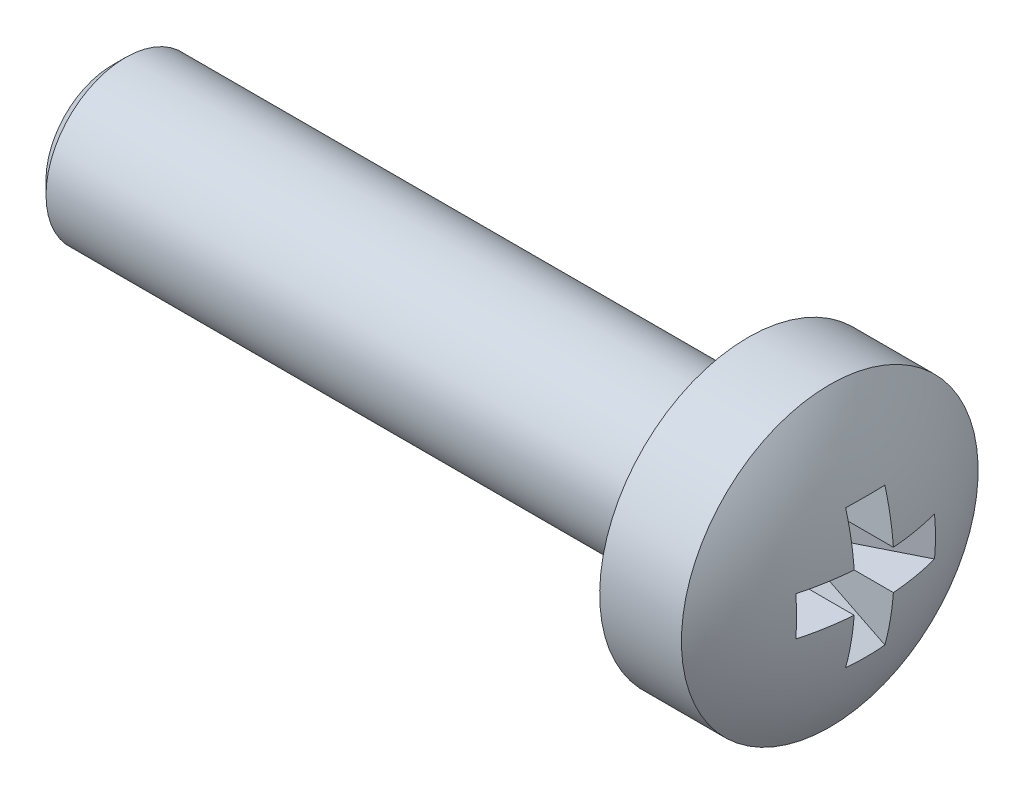
ISO-10303-21;
HEADER;
FILE_DESCRIPTION(('STEP AP214'),'2;1');
FILE_NAME('part.step','',(''),(''),'','','');
FILE_SCHEMA(('AUTOMOTIVE_DESIGN { 1 0 10303 214 1 1 1 1 }'));
ENDSEC;
DATA;
#1=APPLICATION_CONTEXT('core data for automotive mechanical design processes');
#2=APPLICATION_PROTOCOL_DEFINITION('international standard','automotive_design',2000,#1);
#3=PRODUCT_CONTEXT('',#1,'mechanical');
#4=PRODUCT('Part','Part','',(#3));
#5=PRODUCT_RELATED_PRODUCT_CATEGORY('part','',(#4));
#6=PRODUCT_DEFINITION_FORMATION('','',#4);
#7=PRODUCT_DEFINITION_CONTEXT('part definition',#1,'design');
#8=PRODUCT_DEFINITION('design','',#6,#7);
#9=PRODUCT_DEFINITION_SHAPE('','',#8);
#10=(LENGTH_UNIT() NAMED_UNIT(*) SI_UNIT(.MILLI.,.METRE.));
#11=(NAMED_UNIT(*) PLANE_ANGLE_UNIT() SI_UNIT($,.RADIAN.));
#12=(NAMED_UNIT(*) SI_UNIT($,.STERADIAN.) SOLID_ANGLE_UNIT());
#13=UNCERTAINTY_MEASURE_WITH_UNIT(LENGTH_MEASURE(1.E-05),#10,'distance_accuracy_value','');
#14=(GEOMETRIC_REPRESENTATION_CONTEXT(3) GLOBAL_UNCERTAINTY_ASSIGNED_CONTEXT((#13)) GLOBAL_UNIT_ASSIGNED_CONTEXT((#10,
#11,#12)) REPRESENTATION_CONTEXT('',''));
#15=CARTESIAN_POINT('',(0.,0.,0.));
#16=DIRECTION('',(0.,0.,1.));
#17=DIRECTION('',(1.,0.,0.));
#18=AXIS2_PLACEMENT_3D('',#15,#16,#17);
#19=CARTESIAN_POINT('',(-5.,0.,0.));
#20=DIRECTION('',(1.,0.,0.));
#21=DIRECTION('',(0.,-1.,0.));
#22=AXIS2_PLACEMENT_3D('',#19,#20,#21);
#23=SPHERICAL_SURFACE('',#22,5.);
#24=CARTESIAN_POINT('',(-4.56358241491322,0.,-0.875318258911803));
#25=DIRECTION('',(0.446197813109809,0.,-0.894934361602025));
#26=DIRECTION('',(-0.894934361602025,0.,-0.446197813109809));
#27=AXIS2_PLACEMENT_3D('',#24,#25,#26);
#28=CIRCLE('',#27,4.90340265907692);
#29=CARTESIAN_POINT('',(-0.187869730483241,0.37,1.3063316076711));
#30=VERTEX_POINT('',#29);
#31=CARTESIAN_POINT('',(-0.187869730483241,-0.37,1.3063316076711));
#32=VERTEX_POINT('',#31);
#33=EDGE_CURVE('E195',#30,#32,#28,.T.);
#34=ORIENTED_EDGE('',*,*,#33,.F.);
#35=CARTESIAN_POINT('',(-5.,0.37,0.));
#36=DIRECTION('',(0.,-1.,0.));
#37=DIRECTION('',(0.,0.,-1.));
#38=AXIS2_PLACEMENT_3D('',#35,#36,#37);
#39=CIRCLE('',#38,4.98629120689917);
#40=CARTESIAN_POINT('',(-0.0274553797879303,0.37,0.37));
#41=VERTEX_POINT('',#40);
#42=EDGE_CURVE('E114',#30,#41,#39,.F.);
#43=ORIENTED_EDGE('',*,*,#42,.T.);
#44=CARTESIAN_POINT('',(-5.,0.,0.37));
#45=DIRECTION('',(0.,0.,1.));
#46=DIRECTION('',(0.,-1.,0.));
#47=AXIS2_PLACEMENT_3D('',#44,#45,#46);
#48=CIRCLE('',#47,4.98629120689917);
#49=CARTESIAN_POINT('',(-0.187869730483241,1.3063316076711,0.37));
#50=VERTEX_POINT('',#49);
#51=EDGE_CURVE('E146',#50,#41,#48,.F.);
#52=ORIENTED_EDGE('',*,*,#51,.F.);
#53=CARTESIAN_POINT('',(-4.56358241491322,-0.875318258911803,0.));
#54=DIRECTION('',(0.446197813109809,-0.894934361602025,0.));
#55=DIRECTION('',(0.894934361602025,0.446197813109809,0.));
#56=AXIS2_PLACEMENT_3D('',#53,#54,#55);
#57=CIRCLE('',#56,4.90340265907692);
#58=CARTESIAN_POINT('',(-0.187869730483241,1.3063316076711,-0.37));
#59=VERTEX_POINT('',#58);
#60=EDGE_CURVE('E143',#50,#59,#57,.F.);
#61=ORIENTED_EDGE('',*,*,#60,.T.);
#62=CARTESIAN_POINT('',(-5.,0.,-0.37));
#63=DIRECTION('',(0.,0.,1.));
#64=DIRECTION('',(0.,-1.,0.));
#65=AXIS2_PLACEMENT_3D('',#62,#63,#64);
#66=CIRCLE('',#65,4.98629120689917);
#67=CARTESIAN_POINT('',(-0.0274553797879303,0.37,-0.37));
#68=VERTEX_POINT('',#67);
#69=EDGE_CURVE('E147',#59,#68,#66,.F.);
#70=ORIENTED_EDGE('',*,*,#69,.T.);
#71=CARTESIAN_POINT('',(-5.,0.37,0.));
#72=DIRECTION('',(0.,-1.,0.));
#73=DIRECTION('',(0.,0.,-1.));
#74=AXIS2_PLACEMENT_3D('',#71,#72,#73);
#75=CIRCLE('',#74,4.98629120689917);
#76=CARTESIAN_POINT('',(-0.187869730483241,0.37,-1.3063316076711));
#77=VERTEX_POINT('',#76);
#78=EDGE_CURVE('E197',#68,#77,#75,.F.);
#79=ORIENTED_EDGE('',*,*,#78,.T.);
#80=CARTESIAN_POINT('',(-4.56358241491322,0.,0.875318258911803));
#81=DIRECTION('',(0.446197813109809,0.,0.894934361602025));
#82=DIRECTION('',(0.894934361602025,0.,-0.446197813109809));
#83=AXIS2_PLACEMENT_3D('',#80,#81,#82);
#84=CIRCLE('',#83,4.90340265907692);
#85=CARTESIAN_POINT('',(-0.187869730483241,-0.37,-1.3063316076711));
#86=VERTEX_POINT('',#85);
#87=EDGE_CURVE('E200',#77,#86,#84,.F.);
#88=ORIENTED_EDGE('',*,*,#87,.T.);
#89=CARTESIAN_POINT('',(-5.,-0.37,0.));
#90=DIRECTION('',(0.,-1.,0.));
#91=DIRECTION('',(0.,0.,-1.));
#92=AXIS2_PLACEMENT_3D('',#89,#90,#91);
#93=CIRCLE('',#92,4.98629120689917);
#94=CARTESIAN_POINT('',(-0.0274553797879303,-0.37,-0.37));
#95=VERTEX_POINT('',#94);
#96=EDGE_CURVE('E201',#95,#86,#93,.F.);
#97=ORIENTED_EDGE('',*,*,#96,.F.);
#98=CARTESIAN_POINT('',(-5.,0.,-0.37));
#99=DIRECTION('',(0.,0.,1.));
#100=DIRECTION('',(0.,-1.,0.));
#101=AXIS2_PLACEMENT_3D('',#98,#99,#100);
#102=CIRCLE('',#101,4.98629120689917);
#103=CARTESIAN_POINT('',(-0.187869730483241,-1.3063316076711,-0.37));
#104=VERTEX_POINT('',#103);
#105=EDGE_CURVE('E157',#95,#104,#102,.F.);
#106=ORIENTED_EDGE('',*,*,#105,.T.);
#107=CARTESIAN_POINT('',(-4.56358241491322,0.875318258911802,0.));
#108=DIRECTION('',(0.446197813109809,0.894934361602025,0.));
#109=DIRECTION('',(-0.894934361602025,0.446197813109809,0.));
#110=AXIS2_PLACEMENT_3D('',#107,#108,#109);
#111=CIRCLE('',#110,4.90340265907692);
#112=CARTESIAN_POINT('',(-0.187869730483241,-1.3063316076711,0.37));
#113=VERTEX_POINT('',#112);
#114=EDGE_CURVE('E154',#113,#104,#111,.T.);
#115=ORIENTED_EDGE('',*,*,#114,.F.);
#116=CARTESIAN_POINT('',(-5.,0.,0.37));
#117=DIRECTION('',(0.,0.,1.));
#118=DIRECTION('',(0.,-1.,0.));
#119=AXIS2_PLACEMENT_3D('',#116,#117,#118);
#120=CIRCLE('',#119,4.98629120689917);
#121=CARTESIAN_POINT('',(-0.0274553797879303,-0.37,0.37));
#122=VERTEX_POINT('',#121);
#123=EDGE_CURVE('E158',#122,#113,#120,.F.);
#124=ORIENTED_EDGE('',*,*,#123,.F.);
#125=CARTESIAN_POINT('',(-5.,-0.37,0.));
#126=DIRECTION('',(0.,-1.,0.));
#127=DIRECTION('',(0.,0.,-1.));
#128=AXIS2_PLACEMENT_3D('',#125,#126,#127);
#129=CIRCLE('',#128,4.98629120689917);
#130=EDGE_CURVE('E193',#32,#122,#129,.F.);
#131=ORIENTED_EDGE('',*,*,#130,.F.);
#132=EDGE_LOOP('',(#34,#43,#52,#61,#70,#79,#88,#97,#106,#115,#124,#131));
#133=FACE_BOUND('',#132,.T.);
#134=CARTESIAN_POINT('',(-0.857536964558404,0.,0.));
#135=DIRECTION('',(1.,0.,0.));
#136=DIRECTION('',(0.,1.,0.));
#137=AXIS2_PLACEMENT_3D('',#134,#135,#136);
#138=CIRCLE('',#137,2.8);
#139=CARTESIAN_POINT('',(-0.857536964558404,2.8,0.));
#140=VERTEX_POINT('',#139);
#141=EDGE_CURVE('E118',#140,#140,#138,.T.);
#142=ORIENTED_EDGE('',*,*,#141,.T.);
#143=EDGE_LOOP('',(#142));
#144=FACE_BOUND('',#143,.T.);
#145=ADVANCED_FACE('F16',(#133,#144),#23,.T.);
#146=CARTESIAN_POINT('',(-14.4,0.,0.));
#147=DIRECTION('',(-1.,0.,0.));
#148=DIRECTION('',(0.,-1.,0.));
#149=AXIS2_PLACEMENT_3D('',#146,#147,#148);
#150=PLANE('',#149);
#151=CARTESIAN_POINT('',(-14.4,0.,0.));
#152=DIRECTION('',(-1.,0.,0.));
#153=DIRECTION('',(0.,-1.,0.));
#154=AXIS2_PLACEMENT_3D('',#151,#152,#153);
#155=CIRCLE('',#154,1.25);
#156=CARTESIAN_POINT('',(-14.4,-1.25,0.));
#157=VERTEX_POINT('',#156);
#158=EDGE_CURVE('E11',#157,#157,#155,.T.);
#159=ORIENTED_EDGE('',*,*,#158,.T.);
#160=EDGE_LOOP('',(#159));
#161=FACE_BOUND('',#160,.T.);
#162=ADVANCED_FACE('F262',(#161),#150,.T.);
#163=CARTESIAN_POINT('',(0.,0.,0.));
#164=DIRECTION('',(1.,0.,0.));
#165=DIRECTION('',(0.,1.,0.));
#166=AXIS2_PLACEMENT_3D('',#163,#164,#165);
#167=CYLINDRICAL_SURFACE('',#166,1.5);
#168=CARTESIAN_POINT('',(-14.15,0.,0.));
#169=DIRECTION('',(-1.,0.,0.));
#170=DIRECTION('',(0.,-1.,0.));
#171=AXIS2_PLACEMENT_3D('',#168,#169,#170);
#172=CIRCLE('',#171,1.5);
#173=CARTESIAN_POINT('',(-14.15,-1.5,0.));
#174=VERTEX_POINT('',#173);
#175=EDGE_CURVE('E26',#174,#174,#172,.F.);
#176=ORIENTED_EDGE('',*,*,#175,.T.);
#177=EDGE_LOOP('',(#176));
#178=FACE_BOUND('',#177,.T.);
#179=CARTESIAN_POINT('',(-2.4,0.,0.));
#180=DIRECTION('',(1.,0.,0.));
#181=DIRECTION('',(0.,1.,0.));
#182=AXIS2_PLACEMENT_3D('',#179,#180,#181);
#183=CIRCLE('',#182,1.5);
#184=CARTESIAN_POINT('',(-2.4,1.5,0.));
#185=VERTEX_POINT('',#184);
#186=EDGE_CURVE('E190',#185,#185,#183,.T.);
#187=ORIENTED_EDGE('',*,*,#186,.F.);
#188=EDGE_LOOP('',(#187));
#189=FACE_BOUND('',#188,.T.);
#190=ADVANCED_FACE('F268',(#178,#189),#167,.T.);
#191=CARTESIAN_POINT('',(-2.4,1.5,0.));
#192=DIRECTION('',(-1.,0.,0.));
#193=DIRECTION('',(0.,-1.,0.));
#194=AXIS2_PLACEMENT_3D('',#191,#192,#193);
#195=PLANE('',#194);
#196=ORIENTED_EDGE('',*,*,#186,.T.);
#197=EDGE_LOOP('',(#196));
#198=FACE_BOUND('',#197,.T.);
#199=CARTESIAN_POINT('',(-2.4,0.,0.));
#200=DIRECTION('',(1.,0.,0.));
#201=DIRECTION('',(0.,1.,0.));
#202=AXIS2_PLACEMENT_3D('',#199,#200,#201);
#203=CIRCLE('',#202,2.8);
#204=CARTESIAN_POINT('',(-2.4,2.8,0.));
#205=VERTEX_POINT('',#204);
#206=EDGE_CURVE('E187',#205,#205,#203,.T.);
#207=ORIENTED_EDGE('',*,*,#206,.F.);
#208=EDGE_LOOP('',(#207));
#209=FACE_BOUND('',#208,.T.);
#210=ADVANCED_FACE('F299',(#198,#209),#195,.T.);
#211=CARTESIAN_POINT('',(0.,0.,0.));
#212=DIRECTION('',(1.,0.,0.));
#213=DIRECTION('',(0.,1.,0.));
#214=AXIS2_PLACEMENT_3D('',#211,#212,#213);
#215=CYLINDRICAL_SURFACE('',#214,2.8);
#216=ORIENTED_EDGE('',*,*,#206,.T.);
#217=EDGE_LOOP('',(#216));
#218=FACE_BOUND('',#217,.T.);
#219=ORIENTED_EDGE('',*,*,#141,.F.);
#220=EDGE_LOOP('',(#219));
#221=FACE_BOUND('',#220,.T.);
#222=ADVANCED_FACE('F296',(#218,#221),#215,.T.);
#223=CARTESIAN_POINT('',(0.,0.,1.4));
#224=DIRECTION('',(0.446197813109809,0.,-0.894934361602025));
#225=DIRECTION('',(-0.894934361602025,0.,-0.446197813109809));
#226=AXIS2_PLACEMENT_3D('',#223,#224,#225);
#227=PLANE('',#226);
#228=ORIENTED_EDGE('',*,*,#33,.T.);
#229=DIRECTION('',(-0.894934361602025,0.,-0.446197813109809));
#230=VECTOR('',#229,1.);
#231=CARTESIAN_POINT('',(0.,-0.37,1.4));
#232=LINE('',#231,#230);
#233=CARTESIAN_POINT('',(-1.75,-0.37,0.527482185906493));
#234=VERTEX_POINT('',#233);
#235=EDGE_CURVE('E35',#234,#32,#232,.F.);
#236=ORIENTED_EDGE('',*,*,#235,.F.);
#237=DIRECTION('',(0.,1.,0.));
#238=VECTOR('',#237,1.);
#239=CARTESIAN_POINT('',(-1.75,0.,0.527482185906493));
#240=LINE('',#239,#238);
#241=CARTESIAN_POINT('',(-1.75,0.37,0.527482185906493));
#242=VERTEX_POINT('',#241);
#243=EDGE_CURVE('E126',#242,#234,#240,.F.);
#244=ORIENTED_EDGE('',*,*,#243,.F.);
#245=DIRECTION('',(-0.894934361602025,0.,-0.446197813109809));
#246=VECTOR('',#245,1.);
#247=CARTESIAN_POINT('',(0.,0.37,1.4));
#248=LINE('',#247,#246);
#249=EDGE_CURVE('E107',#242,#30,#248,.F.);
#250=ORIENTED_EDGE('',*,*,#249,.T.);
#251=EDGE_LOOP('',(#228,#236,#244,#250));
#252=FACE_BOUND('',#251,.T.);
#253=ADVANCED_FACE('F18',(#252),#227,.T.);
#254=CARTESIAN_POINT('',(-1.75,0.37,0.));
#255=DIRECTION('',(0.,-1.,0.));
#256=DIRECTION('',(0.,0.,-1.));
#257=AXIS2_PLACEMENT_3D('',#254,#255,#256);
#258=PLANE('',#257);
#259=ORIENTED_EDGE('',*,*,#249,.F.);
#260=DIRECTION('',(0.,0.,-1.));
#261=VECTOR('',#260,1.);
#262=CARTESIAN_POINT('',(-1.75,0.37,0.));
#263=LINE('',#262,#261);
#264=CARTESIAN_POINT('',(-1.75,0.37,0.37));
#265=VERTEX_POINT('',#264);
#266=EDGE_CURVE('E111',#242,#265,#263,.T.);
#267=ORIENTED_EDGE('',*,*,#266,.T.);
#268=DIRECTION('',(1.,0.,0.));
#269=VECTOR('',#268,1.);
#270=CARTESIAN_POINT('',(-1.75,0.37,0.37));
#271=LINE('',#270,#269);
#272=EDGE_CURVE('E119',#265,#41,#271,.T.);
#273=ORIENTED_EDGE('',*,*,#272,.T.);
#274=ORIENTED_EDGE('',*,*,#42,.F.);
#275=EDGE_LOOP('',(#259,#267,#273,#274));
#276=FACE_BOUND('',#275,.T.);
#277=ADVANCED_FACE('F109',(#276),#258,.T.);
#278=CARTESIAN_POINT('',(-1.75,0.,0.37));
#279=DIRECTION('',(0.,0.,1.));
#280=DIRECTION('',(0.,-1.,0.));
#281=AXIS2_PLACEMENT_3D('',#278,#279,#280);
#282=PLANE('',#281);
#283=ORIENTED_EDGE('',*,*,#51,.T.);
#284=ORIENTED_EDGE('',*,*,#272,.F.);
#285=DIRECTION('',(0.,-1.,0.));
#286=VECTOR('',#285,1.);
#287=CARTESIAN_POINT('',(-1.75,0.,0.37));
#288=LINE('',#287,#286);
#289=CARTESIAN_POINT('',(-1.75,0.527482185906492,0.37));
#290=VERTEX_POINT('',#289);
#291=EDGE_CURVE('E129',#290,#265,#288,.T.);
#292=ORIENTED_EDGE('',*,*,#291,.F.);
#293=DIRECTION('',(0.894934361602025,0.446197813109809,0.));
#294=VECTOR('',#293,1.);
#295=CARTESIAN_POINT('',(-1.96063300229114,0.42246444491505,0.37));
#296=LINE('',#295,#294);
#297=EDGE_CURVE('E139',#290,#50,#296,.T.);
#298=ORIENTED_EDGE('',*,*,#297,.T.);
#299=EDGE_LOOP('',(#283,#284,#292,#298));
#300=FACE_BOUND('',#299,.T.);
#301=ADVANCED_FACE('F250',(#300),#282,.F.);
#302=CARTESIAN_POINT('',(0.,1.4,0.));
#303=DIRECTION('',(0.446197813109809,-0.894934361602025,0.));
#304=DIRECTION('',(0.894934361602025,0.446197813109809,0.));
#305=AXIS2_PLACEMENT_3D('',#302,#303,#304);
#306=PLANE('',#305);
#307=ORIENTED_EDGE('',*,*,#297,.F.);
#308=DIRECTION('',(0.,0.,-1.));
#309=VECTOR('',#308,1.);
#310=CARTESIAN_POINT('',(-1.75,0.527482185906492,0.));
#311=LINE('',#310,#309);
#312=CARTESIAN_POINT('',(-1.75,0.527482185906492,-0.37));
#313=VERTEX_POINT('',#312);
#314=EDGE_CURVE('E151',#290,#313,#311,.T.);
#315=ORIENTED_EDGE('',*,*,#314,.T.);
#316=DIRECTION('',(0.894934361602025,0.446197813109809,0.));
#317=VECTOR('',#316,1.);
#318=CARTESIAN_POINT('',(-1.96063300229114,0.42246444491505,-0.37));
#319=LINE('',#318,#317);
#320=EDGE_CURVE('E142',#313,#59,#319,.T.);
#321=ORIENTED_EDGE('',*,*,#320,.T.);
#322=ORIENTED_EDGE('',*,*,#60,.F.);
#323=EDGE_LOOP('',(#307,#315,#321,#322));
#324=FACE_BOUND('',#323,.T.);
#325=ADVANCED_FACE('F248',(#324),#306,.T.);
#326=CARTESIAN_POINT('',(-1.75,0.,-0.37));
#327=DIRECTION('',(0.,0.,1.));
#328=DIRECTION('',(0.,-1.,0.));
#329=AXIS2_PLACEMENT_3D('',#326,#327,#328);
#330=PLANE('',#329);
#331=ORIENTED_EDGE('',*,*,#320,.F.);
#332=DIRECTION('',(0.,-1.,0.));
#333=VECTOR('',#332,1.);
#334=CARTESIAN_POINT('',(-1.75,0.,-0.37));
#335=LINE('',#334,#333);
#336=CARTESIAN_POINT('',(-1.75,0.37,-0.37));
#337=VERTEX_POINT('',#336);
#338=EDGE_CURVE('E153',#313,#337,#335,.T.);
#339=ORIENTED_EDGE('',*,*,#338,.T.);
#340=DIRECTION('',(1.,0.,0.));
#341=VECTOR('',#340,1.);
#342=CARTESIAN_POINT('',(-1.75,0.37,-0.37));
#343=LINE('',#342,#341);
#344=EDGE_CURVE('E150',#337,#68,#343,.T.);
#345=ORIENTED_EDGE('',*,*,#344,.T.);
#346=ORIENTED_EDGE('',*,*,#69,.F.);
#347=EDGE_LOOP('',(#331,#339,#345,#346));
#348=FACE_BOUND('',#347,.T.);
#349=ADVANCED_FACE('F245',(#348),#330,.T.);
#350=CARTESIAN_POINT('',(-1.75,0.37,0.));
#351=DIRECTION('',(0.,-1.,0.));
#352=DIRECTION('',(0.,0.,-1.));
#353=AXIS2_PLACEMENT_3D('',#350,#351,#352);
#354=PLANE('',#353);
#355=ORIENTED_EDGE('',*,*,#344,.F.);
#356=DIRECTION('',(0.,0.,-1.));
#357=VECTOR('',#356,1.);
#358=CARTESIAN_POINT('',(-1.75,0.37,0.));
#359=LINE('',#358,#357);
#360=CARTESIAN_POINT('',(-1.75,0.37,-0.527482185906493));
#361=VERTEX_POINT('',#360);
#362=EDGE_CURVE('E173',#337,#361,#359,.T.);
#363=ORIENTED_EDGE('',*,*,#362,.T.);
#364=DIRECTION('',(0.894934361602025,0.,-0.446197813109809));
#365=VECTOR('',#364,1.);
#366=CARTESIAN_POINT('',(0.,0.37,-1.4));
#367=LINE('',#366,#365);
#368=EDGE_CURVE('E180',#361,#77,#367,.T.);
#369=ORIENTED_EDGE('',*,*,#368,.T.);
#370=ORIENTED_EDGE('',*,*,#78,.F.);
#371=EDGE_LOOP('',(#355,#363,#369,#370));
#372=FACE_BOUND('',#371,.T.);
#373=ADVANCED_FACE('F242',(#372),#354,.T.);
#374=CARTESIAN_POINT('',(0.,0.,-1.4));
#375=DIRECTION('',(0.446197813109809,0.,0.894934361602025));
#376=DIRECTION('',(0.894934361602025,0.,-0.446197813109809));
#377=AXIS2_PLACEMENT_3D('',#374,#375,#376);
#378=PLANE('',#377);
#379=ORIENTED_EDGE('',*,*,#368,.F.);
#380=DIRECTION('',(0.,-1.,0.));
#381=VECTOR('',#380,1.);
#382=CARTESIAN_POINT('',(-1.75,0.,-0.527482185906493));
#383=LINE('',#382,#381);
#384=CARTESIAN_POINT('',(-1.75,-0.37,-0.527482185906493));
#385=VERTEX_POINT('',#384);
#386=EDGE_CURVE('E172',#361,#385,#383,.T.);
#387=ORIENTED_EDGE('',*,*,#386,.T.);
#388=DIRECTION('',(0.894934361602025,0.,-0.446197813109809));
#389=VECTOR('',#388,1.);
#390=CARTESIAN_POINT('',(0.,-0.37,-1.4));
#391=LINE('',#390,#389);
#392=EDGE_CURVE('E182',#385,#86,#391,.T.);
#393=ORIENTED_EDGE('',*,*,#392,.T.);
#394=ORIENTED_EDGE('',*,*,#87,.F.);
#395=EDGE_LOOP('',(#379,#387,#393,#394));
#396=FACE_BOUND('',#395,.T.);
#397=ADVANCED_FACE('F236',(#396),#378,.T.);
#398=CARTESIAN_POINT('',(-1.75,-0.37,0.));
#399=DIRECTION('',(0.,-1.,0.));
#400=DIRECTION('',(0.,0.,-1.));
#401=AXIS2_PLACEMENT_3D('',#398,#399,#400);
#402=PLANE('',#401);
#403=ORIENTED_EDGE('',*,*,#96,.T.);
#404=ORIENTED_EDGE('',*,*,#392,.F.);
#405=DIRECTION('',(0.,0.,-1.));
#406=VECTOR('',#405,1.);
#407=CARTESIAN_POINT('',(-1.75,-0.37,0.));
#408=LINE('',#407,#406);
#409=CARTESIAN_POINT('',(-1.75,-0.37,-0.37));
#410=VERTEX_POINT('',#409);
#411=EDGE_CURVE('E165',#410,#385,#408,.T.);
#412=ORIENTED_EDGE('',*,*,#411,.F.);
#413=DIRECTION('',(1.,0.,0.));
#414=VECTOR('',#413,1.);
#415=CARTESIAN_POINT('',(-1.75,-0.37,-0.37));
#416=LINE('',#415,#414);
#417=EDGE_CURVE('E79',#410,#95,#416,.T.);
#418=ORIENTED_EDGE('',*,*,#417,.T.);
#419=EDGE_LOOP('',(#403,#404,#412,#418));
#420=FACE_BOUND('',#419,.T.);
#421=ADVANCED_FACE('F232',(#420),#402,.F.);
#422=CARTESIAN_POINT('',(-1.75,0.,-0.37));
#423=DIRECTION('',(0.,0.,1.));
#424=DIRECTION('',(0.,-1.,0.));
#425=AXIS2_PLACEMENT_3D('',#422,#423,#424);
#426=PLANE('',#425);
#427=ORIENTED_EDGE('',*,*,#417,.F.);
#428=DIRECTION('',(0.,-1.,0.));
#429=VECTOR('',#428,1.);
#430=CARTESIAN_POINT('',(-1.75,0.,-0.37));
#431=LINE('',#430,#429);
#432=CARTESIAN_POINT('',(-1.75,-0.527482185906493,-0.37));
#433=VERTEX_POINT('',#432);
#434=EDGE_CURVE('E73',#410,#433,#431,.T.);
#435=ORIENTED_EDGE('',*,*,#434,.T.);
#436=DIRECTION('',(-0.894934361602025,0.446197813109809,0.));
#437=VECTOR('',#436,1.);
#438=CARTESIAN_POINT('',(-1.96063300229114,-0.42246444491505,-0.37));
#439=LINE('',#438,#437);
#440=EDGE_CURVE('E20',#433,#104,#439,.F.);
#441=ORIENTED_EDGE('',*,*,#440,.T.);
#442=ORIENTED_EDGE('',*,*,#105,.F.);
#443=EDGE_LOOP('',(#427,#435,#441,#442));
#444=FACE_BOUND('',#443,.T.);
#445=ADVANCED_FACE('F228',(#444),#426,.T.);
#446=CARTESIAN_POINT('',(0.,-1.4,0.));
#447=DIRECTION('',(0.446197813109809,0.894934361602025,0.));
#448=DIRECTION('',(-0.894934361602025,0.446197813109809,0.));
#449=AXIS2_PLACEMENT_3D('',#446,#447,#448);
#450=PLANE('',#449);
#451=ORIENTED_EDGE('',*,*,#114,.T.);
#452=ORIENTED_EDGE('',*,*,#440,.F.);
#453=DIRECTION('',(0.,0.,1.));
#454=VECTOR('',#453,1.);
#455=CARTESIAN_POINT('',(-1.75,-0.527482185906493,0.));
#456=LINE('',#455,#454);
#457=CARTESIAN_POINT('',(-1.75,-0.527482185906493,0.37));
#458=VERTEX_POINT('',#457);
#459=EDGE_CURVE('E161',#458,#433,#456,.F.);
#460=ORIENTED_EDGE('',*,*,#459,.F.);
#461=DIRECTION('',(-0.894934361602025,0.446197813109809,0.));
#462=VECTOR('',#461,1.);
#463=CARTESIAN_POINT('',(-1.96063300229114,-0.42246444491505,0.37));
#464=LINE('',#463,#462);
#465=EDGE_CURVE('E159',#458,#113,#464,.F.);
#466=ORIENTED_EDGE('',*,*,#465,.T.);
#467=EDGE_LOOP('',(#451,#452,#460,#466));
#468=FACE_BOUND('',#467,.T.);
#469=ADVANCED_FACE('F227',(#468),#450,.T.);
#470=CARTESIAN_POINT('',(-1.75,0.,0.37));
#471=DIRECTION('',(0.,0.,1.));
#472=DIRECTION('',(0.,-1.,0.));
#473=AXIS2_PLACEMENT_3D('',#470,#471,#472);
#474=PLANE('',#473);
#475=ORIENTED_EDGE('',*,*,#123,.T.);
#476=ORIENTED_EDGE('',*,*,#465,.F.);
#477=DIRECTION('',(0.,-1.,0.));
#478=VECTOR('',#477,1.);
#479=CARTESIAN_POINT('',(-1.75,0.,0.37));
#480=LINE('',#479,#478);
#481=CARTESIAN_POINT('',(-1.75,-0.37,0.37));
#482=VERTEX_POINT('',#481);
#483=EDGE_CURVE('E133',#482,#458,#480,.T.);
#484=ORIENTED_EDGE('',*,*,#483,.F.);
#485=DIRECTION('',(1.,0.,0.));
#486=VECTOR('',#485,1.);
#487=CARTESIAN_POINT('',(-1.75,-0.37,0.37));
#488=LINE('',#487,#486);
#489=EDGE_CURVE('E138',#482,#122,#488,.T.);
#490=ORIENTED_EDGE('',*,*,#489,.T.);
#491=EDGE_LOOP('',(#475,#476,#484,#490));
#492=FACE_BOUND('',#491,.T.);
#493=ADVANCED_FACE('F225',(#492),#474,.F.);
#494=CARTESIAN_POINT('',(-1.75,-0.37,0.));
#495=DIRECTION('',(0.,-1.,0.));
#496=DIRECTION('',(0.,0.,-1.));
#497=AXIS2_PLACEMENT_3D('',#494,#495,#496);
#498=PLANE('',#497);
#499=ORIENTED_EDGE('',*,*,#130,.T.);
#500=ORIENTED_EDGE('',*,*,#489,.F.);
#501=DIRECTION('',(0.,0.,-1.));
#502=VECTOR('',#501,1.);
#503=CARTESIAN_POINT('',(-1.75,-0.37,0.));
#504=LINE('',#503,#502);
#505=EDGE_CURVE('E131',#234,#482,#504,.T.);
#506=ORIENTED_EDGE('',*,*,#505,.F.);
#507=ORIENTED_EDGE('',*,*,#235,.T.);
#508=EDGE_LOOP('',(#499,#500,#506,#507));
#509=FACE_BOUND('',#508,.T.);
#510=ADVANCED_FACE('F223',(#509),#498,.F.);
#511=CARTESIAN_POINT('',(-1.75,0.,0.));
#512=DIRECTION('',(1.,0.,0.));
#513=DIRECTION('',(0.,0.,-1.));
#514=AXIS2_PLACEMENT_3D('',#511,#512,#513);
#515=PLANE('',#514);
#516=ORIENTED_EDGE('',*,*,#243,.T.);
#517=ORIENTED_EDGE('',*,*,#505,.T.);
#518=ORIENTED_EDGE('',*,*,#483,.T.);
#519=ORIENTED_EDGE('',*,*,#459,.T.);
#520=ORIENTED_EDGE('',*,*,#434,.F.);
#521=ORIENTED_EDGE('',*,*,#411,.T.);
#522=ORIENTED_EDGE('',*,*,#386,.F.);
#523=ORIENTED_EDGE('',*,*,#362,.F.);
#524=ORIENTED_EDGE('',*,*,#338,.F.);
#525=ORIENTED_EDGE('',*,*,#314,.F.);
#526=ORIENTED_EDGE('',*,*,#291,.T.);
#527=ORIENTED_EDGE('',*,*,#266,.F.);
#528=EDGE_LOOP('',(#516,#517,#518,#519,#520,#521,#522,#523,#524,#525,#526,#527));
#529=FACE_BOUND('',#528,.T.);
#530=ADVANCED_FACE('F124',(#529),#515,.T.);
#531=CARTESIAN_POINT('',(-14.15,0.,0.));
#532=DIRECTION('',(1.,0.,0.));
#533=DIRECTION('',(0.,1.,0.));
#534=AXIS2_PLACEMENT_3D('',#531,#532,#533);
#535=CONICAL_SURFACE('',#534,1.5,0.785398163397443);
#536=ORIENTED_EDGE('',*,*,#158,.F.);
#537=EDGE_LOOP('',(#536));
#538=FACE_BOUND('',#537,.T.);
#539=ORIENTED_EDGE('',*,*,#175,.F.);
#540=EDGE_LOOP('',(#539));
#541=FACE_BOUND('',#540,.T.);
#542=ADVANCED_FACE('F273',(#538,#541),#535,.T.);
#543=CLOSED_SHELL('',(#145,#162,#190,#210,#222,#253,#277,#301,#325,#349,#373,#397,#421,#445,
#469,#493,#510,#530,#542));
#544=MANIFOLD_SOLID_BREP('B1',#543);
#545=ADVANCED_BREP_SHAPE_REPRESENTATION('',(#18,#544),#14);
#546=SHAPE_DEFINITION_REPRESENTATION(#9,#545);
ENDSEC;
END-ISO-10303-21;
